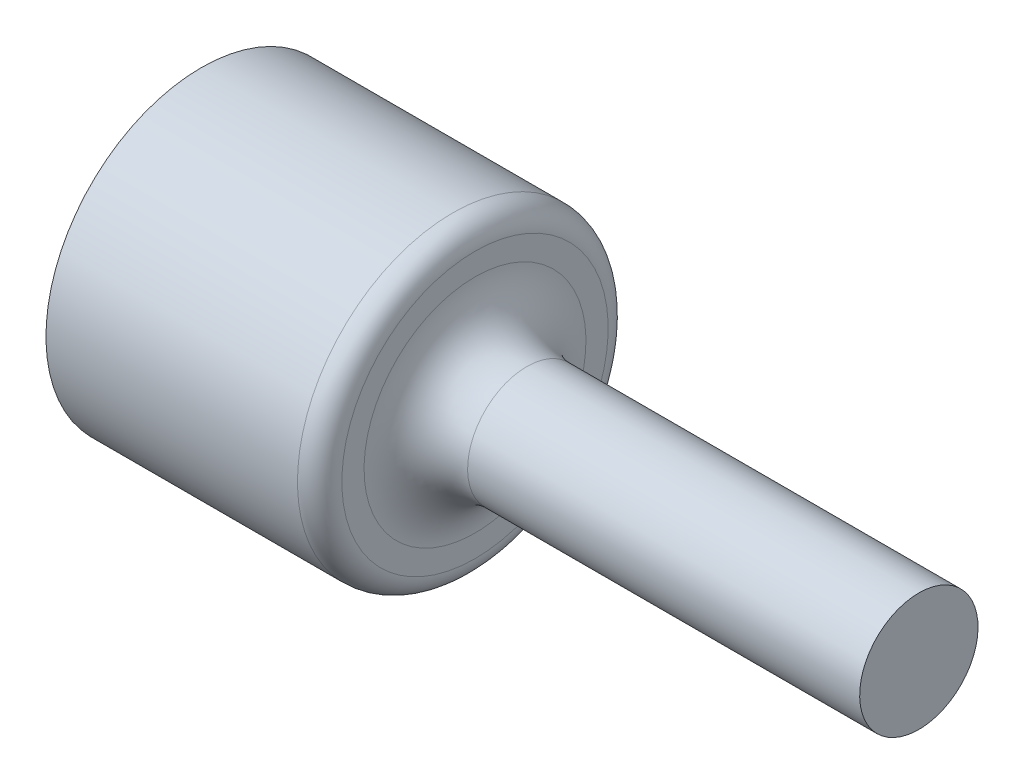
ISO-10303-21;
HEADER;
FILE_DESCRIPTION(('STEP AP214'),'2;1');
FILE_NAME('part.step','',(''),(''),'','','');
FILE_SCHEMA(('AUTOMOTIVE_DESIGN { 1 0 10303 214 1 1 1 1 }'));
ENDSEC;
DATA;
#1=APPLICATION_CONTEXT('core data for automotive mechanical design processes');
#2=APPLICATION_PROTOCOL_DEFINITION('international standard','automotive_design',2000,#1);
#3=PRODUCT_CONTEXT('',#1,'mechanical');
#4=PRODUCT('Part','Part','',(#3));
#5=PRODUCT_RELATED_PRODUCT_CATEGORY('part','',(#4));
#6=PRODUCT_DEFINITION_FORMATION('','',#4);
#7=PRODUCT_DEFINITION_CONTEXT('part definition',#1,'design');
#8=PRODUCT_DEFINITION('design','',#6,#7);
#9=PRODUCT_DEFINITION_SHAPE('','',#8);
#10=(LENGTH_UNIT() NAMED_UNIT(*) SI_UNIT(.MILLI.,.METRE.));
#11=(NAMED_UNIT(*) PLANE_ANGLE_UNIT() SI_UNIT($,.RADIAN.));
#12=(NAMED_UNIT(*) SI_UNIT($,.STERADIAN.) SOLID_ANGLE_UNIT());
#13=UNCERTAINTY_MEASURE_WITH_UNIT(LENGTH_MEASURE(1.E-05),#10,'distance_accuracy_value','');
#14=(GEOMETRIC_REPRESENTATION_CONTEXT(3) GLOBAL_UNCERTAINTY_ASSIGNED_CONTEXT((#13)) GLOBAL_UNIT_ASSIGNED_CONTEXT((#10,
#11,#12)) REPRESENTATION_CONTEXT('',''));
#15=CARTESIAN_POINT('',(0.,0.,0.));
#16=DIRECTION('',(0.,0.,1.));
#17=DIRECTION('',(1.,0.,0.));
#18=AXIS2_PLACEMENT_3D('',#15,#16,#17);
#19=CARTESIAN_POINT('',(0.,0.,0.));
#20=DIRECTION('',(-1.,0.,0.));
#21=DIRECTION('',(0.,-1.,0.));
#22=AXIS2_PLACEMENT_3D('',#19,#20,#21);
#23=PLANE('',#22);
#24=CARTESIAN_POINT('',(0.,0.,0.));
#25=DIRECTION('',(1.,0.,0.));
#26=DIRECTION('',(0.,1.,0.));
#27=AXIS2_PLACEMENT_3D('',#24,#25,#26);
#28=CIRCLE('',#27,21.);
#29=CARTESIAN_POINT('',(0.,21.,0.));
#30=VERTEX_POINT('',#29);
#31=EDGE_CURVE('E51',#30,#30,#28,.T.);
#32=ORIENTED_EDGE('',*,*,#31,.F.);
#33=EDGE_LOOP('',(#32));
#34=FACE_BOUND('',#33,.T.);
#35=ADVANCED_FACE('F31',(#34),#23,.T.);
#36=CARTESIAN_POINT('',(97.,0.,0.));
#37=DIRECTION('',(1.,0.,0.));
#38=DIRECTION('',(0.,1.,0.));
#39=AXIS2_PLACEMENT_3D('',#36,#37,#38);
#40=CYLINDRICAL_SURFACE('',#39,21.);
#41=CARTESIAN_POINT('',(34.,0.,0.));
#42=DIRECTION('',(1.,0.,0.));
#43=DIRECTION('',(0.,1.,0.));
#44=AXIS2_PLACEMENT_3D('',#41,#42,#43);
#45=CIRCLE('',#44,21.);
#46=CARTESIAN_POINT('',(34.,21.,0.));
#47=VERTEX_POINT('',#46);
#48=EDGE_CURVE('E42',#47,#47,#45,.F.);
#49=ORIENTED_EDGE('',*,*,#48,.T.);
#50=EDGE_LOOP('',(#49));
#51=FACE_BOUND('',#50,.T.);
#52=ORIENTED_EDGE('',*,*,#31,.T.);
#53=EDGE_LOOP('',(#52));
#54=FACE_BOUND('',#53,.T.);
#55=ADVANCED_FACE('F70',(#51,#54),#40,.T.);
#56=CARTESIAN_POINT('',(37.,21.,0.));
#57=DIRECTION('',(1.,0.,0.));
#58=DIRECTION('',(0.,1.,0.));
#59=AXIS2_PLACEMENT_3D('',#56,#57,#58);
#60=PLANE('',#59);
#61=CARTESIAN_POINT('',(37.,0.,0.));
#62=DIRECTION('',(1.,0.,0.));
#63=DIRECTION('',(0.,1.,0.));
#64=AXIS2_PLACEMENT_3D('',#61,#62,#63);
#65=CIRCLE('',#64,15.);
#66=CARTESIAN_POINT('',(37.,15.,0.));
#67=VERTEX_POINT('',#66);
#68=EDGE_CURVE('E10',#67,#67,#65,.F.);
#69=ORIENTED_EDGE('',*,*,#68,.T.);
#70=EDGE_LOOP('',(#69));
#71=FACE_BOUND('',#70,.T.);
#72=CARTESIAN_POINT('',(37.,0.,0.));
#73=DIRECTION('',(1.,0.,0.));
#74=DIRECTION('',(0.,1.,0.));
#75=AXIS2_PLACEMENT_3D('',#72,#73,#74);
#76=CIRCLE('',#75,18.);
#77=CARTESIAN_POINT('',(37.,18.,0.));
#78=VERTEX_POINT('',#77);
#79=EDGE_CURVE('E46',#78,#78,#76,.T.);
#80=ORIENTED_EDGE('',*,*,#79,.T.);
#81=EDGE_LOOP('',(#80));
#82=FACE_BOUND('',#81,.T.);
#83=ADVANCED_FACE('F62',(#71,#82),#60,.T.);
#84=CARTESIAN_POINT('',(97.,0.,0.));
#85=DIRECTION('',(1.,0.,0.));
#86=DIRECTION('',(0.,1.,0.));
#87=AXIS2_PLACEMENT_3D('',#84,#85,#86);
#88=CYLINDRICAL_SURFACE('',#87,8.);
#89=CARTESIAN_POINT('',(44.,0.,0.));
#90=DIRECTION('',(1.,0.,0.));
#91=DIRECTION('',(0.,1.,0.));
#92=AXIS2_PLACEMENT_3D('',#89,#90,#91);
#93=CIRCLE('',#92,8.);
#94=CARTESIAN_POINT('',(44.,8.,0.));
#95=VERTEX_POINT('',#94);
#96=EDGE_CURVE('E38',#95,#95,#93,.T.);
#97=ORIENTED_EDGE('',*,*,#96,.T.);
#98=EDGE_LOOP('',(#97));
#99=FACE_BOUND('',#98,.T.);
#100=CARTESIAN_POINT('',(97.,0.,0.));
#101=DIRECTION('',(1.,0.,0.));
#102=DIRECTION('',(0.,1.,0.));
#103=AXIS2_PLACEMENT_3D('',#100,#101,#102);
#104=CIRCLE('',#103,8.);
#105=CARTESIAN_POINT('',(97.,8.,0.));
#106=VERTEX_POINT('',#105);
#107=EDGE_CURVE('E54',#106,#106,#104,.T.);
#108=ORIENTED_EDGE('',*,*,#107,.F.);
#109=EDGE_LOOP('',(#108));
#110=FACE_BOUND('',#109,.T.);
#111=ADVANCED_FACE('F60',(#99,#110),#88,.T.);
#112=CARTESIAN_POINT('',(97.,8.,0.));
#113=DIRECTION('',(1.,0.,0.));
#114=DIRECTION('',(0.,1.,0.));
#115=AXIS2_PLACEMENT_3D('',#112,#113,#114);
#116=PLANE('',#115);
#117=ORIENTED_EDGE('',*,*,#107,.T.);
#118=EDGE_LOOP('',(#117));
#119=FACE_BOUND('',#118,.T.);
#120=ADVANCED_FACE('F58',(#119),#116,.T.);
#121=CARTESIAN_POINT('',(34.,0.,0.));
#122=DIRECTION('',(1.,0.,0.));
#123=DIRECTION('',(0.,1.,0.));
#124=AXIS2_PLACEMENT_3D('',#121,#122,#123);
#125=TOROIDAL_SURFACE('',#124,18.,3.);
#126=ORIENTED_EDGE('',*,*,#48,.F.);
#127=EDGE_LOOP('',(#126));
#128=FACE_BOUND('',#127,.T.);
#129=ORIENTED_EDGE('',*,*,#79,.F.);
#130=EDGE_LOOP('',(#129));
#131=FACE_BOUND('',#130,.T.);
#132=ADVANCED_FACE('F68',(#128,#131),#125,.T.);
#133=CARTESIAN_POINT('',(44.,0.,0.));
#134=DIRECTION('',(1.,0.,0.));
#135=DIRECTION('',(0.,1.,0.));
#136=AXIS2_PLACEMENT_3D('',#133,#134,#135);
#137=TOROIDAL_SURFACE('',#136,15.,7.);
#138=ORIENTED_EDGE('',*,*,#68,.F.);
#139=EDGE_LOOP('',(#138));
#140=FACE_BOUND('',#139,.T.);
#141=ORIENTED_EDGE('',*,*,#96,.F.);
#142=EDGE_LOOP('',(#141));
#143=FACE_BOUND('',#142,.T.);
#144=ADVANCED_FACE('F33',(#140,#143),#137,.F.);
#145=CLOSED_SHELL('',(#35,#55,#83,#111,#120,#132,#144));
#146=MANIFOLD_SOLID_BREP('B2',#145);
#147=ADVANCED_BREP_SHAPE_REPRESENTATION('',(#18,#146),#14);
#148=SHAPE_DEFINITION_REPRESENTATION(#9,#147);
ENDSEC;
END-ISO-10303-21;
